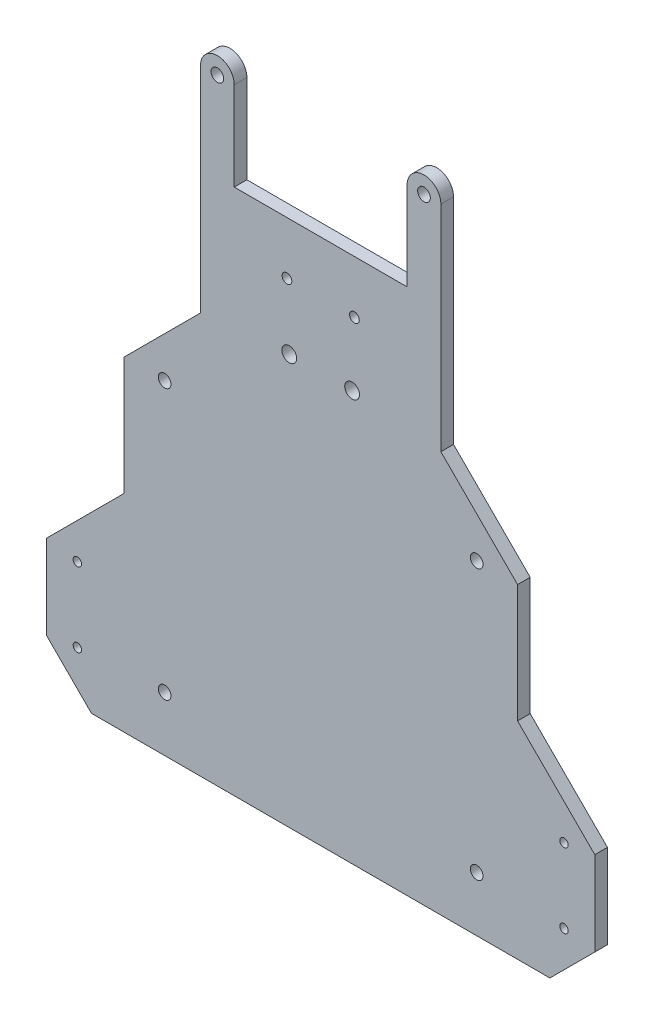
ISO-10303-21;
HEADER;
FILE_DESCRIPTION(('STEP AP214'),'2;1');
FILE_NAME('part.step','',(''),(''),'','','');
FILE_SCHEMA(('AUTOMOTIVE_DESIGN { 1 0 10303 214 1 1 1 1 }'));
ENDSEC;
DATA;
#1=APPLICATION_CONTEXT('core data for automotive mechanical design processes');
#2=APPLICATION_PROTOCOL_DEFINITION('international standard','automotive_design',2000,#1);
#3=PRODUCT_CONTEXT('',#1,'mechanical');
#4=PRODUCT('Part','Part','',(#3));
#5=PRODUCT_RELATED_PRODUCT_CATEGORY('part','',(#4));
#6=PRODUCT_DEFINITION_FORMATION('','',#4);
#7=PRODUCT_DEFINITION_CONTEXT('part definition',#1,'design');
#8=PRODUCT_DEFINITION('design','',#6,#7);
#9=PRODUCT_DEFINITION_SHAPE('','',#8);
#10=(LENGTH_UNIT() NAMED_UNIT(*) SI_UNIT(.MILLI.,.METRE.));
#11=(NAMED_UNIT(*) PLANE_ANGLE_UNIT() SI_UNIT($,.RADIAN.));
#12=(NAMED_UNIT(*) SI_UNIT($,.STERADIAN.) SOLID_ANGLE_UNIT());
#13=UNCERTAINTY_MEASURE_WITH_UNIT(LENGTH_MEASURE(1.E-05),#10,'distance_accuracy_value','');
#14=(GEOMETRIC_REPRESENTATION_CONTEXT(3) GLOBAL_UNCERTAINTY_ASSIGNED_CONTEXT((#13)) GLOBAL_UNIT_ASSIGNED_CONTEXT((#10,
#11,#12)) REPRESENTATION_CONTEXT('',''));
#15=CARTESIAN_POINT('',(0.,0.,0.));
#16=DIRECTION('',(0.,0.,1.));
#17=DIRECTION('',(1.,0.,0.));
#18=AXIS2_PLACEMENT_3D('',#15,#16,#17);
#19=CARTESIAN_POINT('',(-24.5,146.,3.));
#20=DIRECTION('',(0.,0.,1.));
#21=DIRECTION('',(1.,0.,0.));
#22=AXIS2_PLACEMENT_3D('',#19,#20,#21);
#23=PLANE('',#22);
#24=CARTESIAN_POINT('',(-8.,112.5,3.));
#25=DIRECTION('',(0.,0.,1.));
#26=DIRECTION('',(1.,0.,0.));
#27=AXIS2_PLACEMENT_3D('',#24,#25,#26);
#28=CIRCLE('',#27,1.14999999999999);
#29=CARTESIAN_POINT('',(-6.85,112.5,3.));
#30=VERTEX_POINT('',#29);
#31=EDGE_CURVE('E414',#30,#30,#28,.T.);
#32=ORIENTED_EDGE('',*,*,#31,.F.);
#33=EDGE_LOOP('',(#32));
#34=FACE_BOUND('',#33,.T.);
#35=CARTESIAN_POINT('',(-37.0000000000005,13.0000000000001,3.));
#36=DIRECTION('',(0.,0.,1.));
#37=DIRECTION('',(1.,0.,0.));
#38=AXIS2_PLACEMENT_3D('',#35,#36,#37);
#39=CIRCLE('',#38,1.50000000000044);
#40=CARTESIAN_POINT('',(-35.5000000000001,13.0000000000001,3.));
#41=VERTEX_POINT('',#40);
#42=EDGE_CURVE('E426',#41,#41,#39,.T.);
#43=ORIENTED_EDGE('',*,*,#42,.F.);
#44=EDGE_LOOP('',(#43));
#45=FACE_BOUND('',#44,.T.);
#46=CARTESIAN_POINT('',(57.7,29.4525922948518,3.));
#47=DIRECTION('',(0.,0.,1.));
#48=DIRECTION('',(1.,0.,0.));
#49=AXIS2_PLACEMENT_3D('',#46,#47,#48);
#50=CIRCLE('',#49,0.999999999999998);
#51=CARTESIAN_POINT('',(58.7,29.4525922948518,3.));
#52=VERTEX_POINT('',#51);
#53=EDGE_CURVE('E438',#52,#52,#50,.T.);
#54=ORIENTED_EDGE('',*,*,#53,.F.);
#55=EDGE_LOOP('',(#54));
#56=FACE_BOUND('',#55,.T.);
#57=CARTESIAN_POINT('',(-57.7000000000001,11.8525922948518,3.));
#58=DIRECTION('',(0.,0.,1.));
#59=DIRECTION('',(1.,0.,0.));
#60=AXIS2_PLACEMENT_3D('',#57,#58,#59);
#61=CIRCLE('',#60,0.999999999999991);
#62=CARTESIAN_POINT('',(-56.7000000000001,11.8525922948518,3.));
#63=VERTEX_POINT('',#62);
#64=EDGE_CURVE('E450',#63,#63,#61,.T.);
#65=ORIENTED_EDGE('',*,*,#64,.F.);
#66=EDGE_LOOP('',(#65));
#67=FACE_BOUND('',#66,.T.);
#68=CARTESIAN_POINT('',(37.,77.,3.));
#69=DIRECTION('',(0.,0.,1.));
#70=DIRECTION('',(1.,0.,0.));
#71=AXIS2_PLACEMENT_3D('',#68,#69,#70);
#72=CIRCLE('',#71,1.5);
#73=CARTESIAN_POINT('',(38.5,77.,3.));
#74=VERTEX_POINT('',#73);
#75=EDGE_CURVE('E462',#74,#74,#72,.T.);
#76=ORIENTED_EDGE('',*,*,#75,.F.);
#77=EDGE_LOOP('',(#76));
#78=FACE_BOUND('',#77,.T.);
#79=CARTESIAN_POINT('',(-24.5,146.,3.));
#80=DIRECTION('',(0.,0.,1.));
#81=DIRECTION('',(1.,0.,0.));
#82=AXIS2_PLACEMENT_3D('',#79,#80,#81);
#83=CIRCLE('',#82,1.5);
#84=CARTESIAN_POINT('',(-23.,146.,3.));
#85=VERTEX_POINT('',#84);
#86=EDGE_CURVE('E474',#85,#85,#83,.T.);
#87=ORIENTED_EDGE('',*,*,#86,.F.);
#88=EDGE_LOOP('',(#87));
#89=FACE_BOUND('',#88,.T.);
#90=CARTESIAN_POINT('',(7.44999999999998,97.1948700589276,3.));
#91=DIRECTION('',(0.,0.,1.));
#92=DIRECTION('',(1.,0.,0.));
#93=AXIS2_PLACEMENT_3D('',#90,#91,#92);
#94=CIRCLE('',#93,1.75);
#95=CARTESIAN_POINT('',(9.19999999999999,97.1948700589276,3.));
#96=VERTEX_POINT('',#95);
#97=EDGE_CURVE('E199',#96,#96,#94,.T.);
#98=ORIENTED_EDGE('',*,*,#97,.F.);
#99=EDGE_LOOP('',(#98));
#100=FACE_BOUND('',#99,.T.);
#101=CARTESIAN_POINT('',(-24.5,146.,3.));
#102=DIRECTION('',(0.,0.,1.));
#103=DIRECTION('',(1.,0.,0.));
#104=AXIS2_PLACEMENT_3D('',#101,#102,#103);
#105=CIRCLE('',#104,3.99999999999997);
#106=CARTESIAN_POINT('',(-20.5,146.,3.));
#107=VERTEX_POINT('',#106);
#108=CARTESIAN_POINT('',(-28.4999999999999,146.,3.));
#109=VERTEX_POINT('',#108);
#110=EDGE_CURVE('E230',#107,#109,#105,.T.);
#111=ORIENTED_EDGE('',*,*,#110,.T.);
#112=DIRECTION('',(0.,-1.,0.));
#113=VECTOR('',#112,1.);
#114=CARTESIAN_POINT('',(-28.4999999999999,146.,3.));
#115=LINE('',#114,#113);
#116=CARTESIAN_POINT('',(-28.5000000000001,95.1525922948518,3.));
#117=VERTEX_POINT('',#116);
#118=EDGE_CURVE('E128',#109,#117,#115,.T.);
#119=ORIENTED_EDGE('',*,*,#118,.T.);
#120=DIRECTION('',(-0.707106781186546,-0.707106781186549,0.));
#121=VECTOR('',#120,1.);
#122=CARTESIAN_POINT('',(-28.5000000000001,95.1525922948518,3.));
#123=LINE('',#122,#121);
#124=CARTESIAN_POINT('',(-46.689180080496,76.9634122143558,3.));
#125=VERTEX_POINT('',#124);
#126=EDGE_CURVE('E275',#117,#125,#123,.T.);
#127=ORIENTED_EDGE('',*,*,#126,.T.);
#128=DIRECTION('',(0.,-1.,0.));
#129=VECTOR('',#128,1.);
#130=CARTESIAN_POINT('',(-46.689180080496,76.9634122143558,3.));
#131=LINE('',#130,#129);
#132=CARTESIAN_POINT('',(-46.689180080496,48.9634122143558,3.));
#133=VERTEX_POINT('',#132);
#134=EDGE_CURVE('E294',#125,#133,#131,.T.);
#135=ORIENTED_EDGE('',*,*,#134,.T.);
#136=DIRECTION('',(-0.707106781186547,-0.707106781186548,0.));
#137=VECTOR('',#136,1.);
#138=CARTESIAN_POINT('',(-46.689180080496,48.9634122143558,3.));
#139=LINE('',#138,#137);
#140=CARTESIAN_POINT('',(-65.,30.6525922948518,3.));
#141=VERTEX_POINT('',#140);
#142=EDGE_CURVE('E291',#133,#141,#139,.T.);
#143=ORIENTED_EDGE('',*,*,#142,.T.);
#144=DIRECTION('',(0.,-1.,0.));
#145=VECTOR('',#144,1.);
#146=CARTESIAN_POINT('',(-65.,30.6525922948518,3.));
#147=LINE('',#146,#145);
#148=CARTESIAN_POINT('',(-65.,10.6525922948518,3.));
#149=VERTEX_POINT('',#148);
#150=EDGE_CURVE('E293',#141,#149,#147,.T.);
#151=ORIENTED_EDGE('',*,*,#150,.T.);
#152=DIRECTION('',(0.707106781186544,-0.707106781186551,0.));
#153=VECTOR('',#152,1.);
#154=CARTESIAN_POINT('',(-65.,10.6525922948518,3.));
#155=LINE('',#154,#153);
#156=CARTESIAN_POINT('',(-54.3474077051483,0.,3.));
#157=VERTEX_POINT('',#156);
#158=EDGE_CURVE('E296',#149,#157,#155,.T.);
#159=ORIENTED_EDGE('',*,*,#158,.T.);
#160=DIRECTION('',(1.,0.,0.));
#161=VECTOR('',#160,1.);
#162=CARTESIAN_POINT('',(-54.3474077051483,0.,3.));
#163=LINE('',#162,#161);
#164=CARTESIAN_POINT('',(54.3474077051483,5.66428228146502E-13,3.));
#165=VERTEX_POINT('',#164);
#166=EDGE_CURVE('E302',#157,#165,#163,.T.);
#167=ORIENTED_EDGE('',*,*,#166,.T.);
#168=DIRECTION('',(0.707106781186544,0.707106781186551,0.));
#169=VECTOR('',#168,1.);
#170=CARTESIAN_POINT('',(54.3474077051483,5.66428228146502E-13,3.));
#171=LINE('',#170,#169);
#172=CARTESIAN_POINT('',(64.9999999999999,10.6525922948523,3.));
#173=VERTEX_POINT('',#172);
#174=EDGE_CURVE('E304',#165,#173,#171,.T.);
#175=ORIENTED_EDGE('',*,*,#174,.T.);
#176=DIRECTION('',(0.,1.,0.));
#177=VECTOR('',#176,1.);
#178=CARTESIAN_POINT('',(64.9999999999999,10.6525922948523,3.));
#179=LINE('',#178,#177);
#180=CARTESIAN_POINT('',(64.9999999999998,30.6525922948524,3.));
#181=VERTEX_POINT('',#180);
#182=EDGE_CURVE('E306',#173,#181,#179,.T.);
#183=ORIENTED_EDGE('',*,*,#182,.T.);
#184=DIRECTION('',(-0.707106781186551,0.707106781186544,0.));
#185=VECTOR('',#184,1.);
#186=CARTESIAN_POINT('',(64.9999999999998,30.6525922948524,3.));
#187=LINE('',#186,#185);
#188=CARTESIAN_POINT('',(46.6891800804957,48.9634122143563,3.));
#189=VERTEX_POINT('',#188);
#190=EDGE_CURVE('E308',#181,#189,#187,.T.);
#191=ORIENTED_EDGE('',*,*,#190,.T.);
#192=DIRECTION('',(0.,1.,0.));
#193=VECTOR('',#192,1.);
#194=CARTESIAN_POINT('',(46.6891800804957,48.9634122143563,3.));
#195=LINE('',#194,#193);
#196=CARTESIAN_POINT('',(46.6891800804956,76.9634122143567,3.));
#197=VERTEX_POINT('',#196);
#198=EDGE_CURVE('E310',#189,#197,#195,.T.);
#199=ORIENTED_EDGE('',*,*,#198,.T.);
#200=DIRECTION('',(-0.707106781186551,0.707106781186544,0.));
#201=VECTOR('',#200,1.);
#202=CARTESIAN_POINT('',(46.6891800804956,76.9634122143567,3.));
#203=LINE('',#202,#201);
#204=CARTESIAN_POINT('',(28.4999999999996,95.1525922948524,3.));
#205=VERTEX_POINT('',#204);
#206=EDGE_CURVE('E312',#197,#205,#203,.T.);
#207=ORIENTED_EDGE('',*,*,#206,.T.);
#208=DIRECTION('',(0.,1.,0.));
#209=VECTOR('',#208,1.);
#210=CARTESIAN_POINT('',(28.4999999999996,95.1525922948524,3.));
#211=LINE('',#210,#209);
#212=CARTESIAN_POINT('',(28.4999999999994,146.000000000001,3.));
#213=VERTEX_POINT('',#212);
#214=EDGE_CURVE('E314',#205,#213,#211,.T.);
#215=ORIENTED_EDGE('',*,*,#214,.T.);
#216=CARTESIAN_POINT('',(24.5000000000001,146.,3.));
#217=DIRECTION('',(0.,0.,1.));
#218=DIRECTION('',(1.,0.,0.));
#219=AXIS2_PLACEMENT_3D('',#216,#217,#218);
#220=CIRCLE('',#219,3.99999999999934);
#221=CARTESIAN_POINT('',(20.5000000000007,146.,3.));
#222=VERTEX_POINT('',#221);
#223=EDGE_CURVE('E177',#213,#222,#220,.T.);
#224=ORIENTED_EDGE('',*,*,#223,.T.);
#225=DIRECTION('',(0.,-1.,0.));
#226=VECTOR('',#225,1.);
#227=CARTESIAN_POINT('',(20.5000000000007,146.,3.));
#228=LINE('',#227,#226);
#229=CARTESIAN_POINT('',(20.5000000000002,125.,3.));
#230=VERTEX_POINT('',#229);
#231=EDGE_CURVE('E171',#222,#230,#228,.T.);
#232=ORIENTED_EDGE('',*,*,#231,.T.);
#233=DIRECTION('',(-1.,0.,0.));
#234=VECTOR('',#233,1.);
#235=CARTESIAN_POINT('',(20.5000000000002,125.,3.));
#236=LINE('',#235,#234);
#237=CARTESIAN_POINT('',(-20.5000000000001,125.,3.));
#238=VERTEX_POINT('',#237);
#239=EDGE_CURVE('E175',#230,#238,#236,.T.);
#240=ORIENTED_EDGE('',*,*,#239,.T.);
#241=DIRECTION('',(0.,1.,0.));
#242=VECTOR('',#241,1.);
#243=CARTESIAN_POINT('',(-20.5000000000001,125.,3.));
#244=LINE('',#243,#242);
#245=EDGE_CURVE('E55',#238,#107,#244,.T.);
#246=ORIENTED_EDGE('',*,*,#245,.T.);
#247=EDGE_LOOP('',(#111,#119,#127,#135,#143,#151,#159,#167,#175,#183,#191,#199,#207,#215,#224,
#232,#240,#246));
#248=FACE_BOUND('',#247,.T.);
#249=CARTESIAN_POINT('',(8.,112.5,3.));
#250=DIRECTION('',(0.,0.,1.));
#251=DIRECTION('',(-1.,0.,0.));
#252=AXIS2_PLACEMENT_3D('',#249,#250,#251);
#253=CIRCLE('',#252,1.14999999999999);
#254=CARTESIAN_POINT('',(6.85,112.5,3.));
#255=VERTEX_POINT('',#254);
#256=EDGE_CURVE('E480',#255,#255,#253,.T.);
#257=ORIENTED_EDGE('',*,*,#256,.F.);
#258=EDGE_LOOP('',(#257));
#259=FACE_BOUND('',#258,.T.);
#260=CARTESIAN_POINT('',(36.9999999999996,13.0000000000023,3.));
#261=DIRECTION('',(0.,0.,1.));
#262=DIRECTION('',(1.,0.,0.));
#263=AXIS2_PLACEMENT_3D('',#260,#261,#262);
#264=CIRCLE('',#263,1.49999999999972);
#265=CARTESIAN_POINT('',(38.4999999999993,13.0000000000023,3.));
#266=VERTEX_POINT('',#265);
#267=EDGE_CURVE('E468',#266,#266,#264,.T.);
#268=ORIENTED_EDGE('',*,*,#267,.F.);
#269=EDGE_LOOP('',(#268));
#270=FACE_BOUND('',#269,.T.);
#271=CARTESIAN_POINT('',(57.7,11.8525922948518,3.));
#272=DIRECTION('',(0.,0.,1.));
#273=DIRECTION('',(1.,0.,0.));
#274=AXIS2_PLACEMENT_3D('',#271,#272,#273);
#275=CIRCLE('',#274,0.999999999999991);
#276=CARTESIAN_POINT('',(58.7,11.8525922948518,3.));
#277=VERTEX_POINT('',#276);
#278=EDGE_CURVE('E456',#277,#277,#275,.T.);
#279=ORIENTED_EDGE('',*,*,#278,.F.);
#280=EDGE_LOOP('',(#279));
#281=FACE_BOUND('',#280,.T.);
#282=CARTESIAN_POINT('',(-57.7000000000001,29.4525922948518,3.));
#283=DIRECTION('',(0.,0.,1.));
#284=DIRECTION('',(1.,0.,0.));
#285=AXIS2_PLACEMENT_3D('',#282,#283,#284);
#286=CIRCLE('',#285,0.999999999999998);
#287=CARTESIAN_POINT('',(-56.7000000000001,29.4525922948518,3.));
#288=VERTEX_POINT('',#287);
#289=EDGE_CURVE('E444',#288,#288,#286,.T.);
#290=ORIENTED_EDGE('',*,*,#289,.F.);
#291=EDGE_LOOP('',(#290));
#292=FACE_BOUND('',#291,.T.);
#293=CARTESIAN_POINT('',(-37.0000000000075,77.0000000000001,3.));
#294=DIRECTION('',(0.,0.,1.));
#295=DIRECTION('',(1.,0.,0.));
#296=AXIS2_PLACEMENT_3D('',#293,#294,#295);
#297=CIRCLE('',#296,1.50000000000712);
#298=CARTESIAN_POINT('',(-35.5000000000004,77.0000000000001,3.));
#299=VERTEX_POINT('',#298);
#300=EDGE_CURVE('E432',#299,#299,#297,.T.);
#301=ORIENTED_EDGE('',*,*,#300,.F.);
#302=EDGE_LOOP('',(#301));
#303=FACE_BOUND('',#302,.T.);
#304=CARTESIAN_POINT('',(24.5000000000001,146.,3.));
#305=DIRECTION('',(0.,0.,1.));
#306=DIRECTION('',(1.,0.,0.));
#307=AXIS2_PLACEMENT_3D('',#304,#305,#306);
#308=CIRCLE('',#307,1.49999999999982);
#309=CARTESIAN_POINT('',(25.9999999999999,146.,3.));
#310=VERTEX_POINT('',#309);
#311=EDGE_CURVE('E420',#310,#310,#308,.T.);
#312=ORIENTED_EDGE('',*,*,#311,.F.);
#313=EDGE_LOOP('',(#312));
#314=FACE_BOUND('',#313,.T.);
#315=CARTESIAN_POINT('',(-7.45000000000001,97.1948700589276,3.));
#316=DIRECTION('',(0.,0.,1.));
#317=DIRECTION('',(1.,0.,0.));
#318=AXIS2_PLACEMENT_3D('',#315,#316,#317);
#319=CIRCLE('',#318,1.75);
#320=CARTESIAN_POINT('',(-5.7,97.1948700589276,3.));
#321=VERTEX_POINT('',#320);
#322=EDGE_CURVE('E405',#321,#321,#319,.T.);
#323=ORIENTED_EDGE('',*,*,#322,.F.);
#324=EDGE_LOOP('',(#323));
#325=FACE_BOUND('',#324,.T.);
#326=ADVANCED_FACE('F38',(#34,#45,#56,#67,#78,#89,#100,#248,#259,#270,#281,#292,#303,#314,#325),
#23,.T.);
#327=CARTESIAN_POINT('',(-24.5,146.,0.));
#328=DIRECTION('',(0.,0.,1.));
#329=DIRECTION('',(1.,0.,0.));
#330=AXIS2_PLACEMENT_3D('',#327,#328,#329);
#331=PLANE('',#330);
#332=CARTESIAN_POINT('',(-24.5,146.,0.));
#333=DIRECTION('',(0.,0.,1.));
#334=DIRECTION('',(1.,0.,0.));
#335=AXIS2_PLACEMENT_3D('',#332,#333,#334);
#336=CIRCLE('',#335,3.99999999999997);
#337=CARTESIAN_POINT('',(-20.5,146.,0.));
#338=VERTEX_POINT('',#337);
#339=CARTESIAN_POINT('',(-28.4999999999999,146.,0.));
#340=VERTEX_POINT('',#339);
#341=EDGE_CURVE('E195',#338,#340,#336,.T.);
#342=ORIENTED_EDGE('',*,*,#341,.F.);
#343=DIRECTION('',(0.,1.,0.));
#344=VECTOR('',#343,1.);
#345=CARTESIAN_POINT('',(-20.5000000000001,125.,0.));
#346=LINE('',#345,#344);
#347=CARTESIAN_POINT('',(-20.5000000000001,125.,0.));
#348=VERTEX_POINT('',#347);
#349=EDGE_CURVE('E120',#348,#338,#346,.T.);
#350=ORIENTED_EDGE('',*,*,#349,.F.);
#351=DIRECTION('',(-1.,0.,0.));
#352=VECTOR('',#351,1.);
#353=CARTESIAN_POINT('',(20.5000000000002,125.,0.));
#354=LINE('',#353,#352);
#355=CARTESIAN_POINT('',(20.5000000000002,125.,0.));
#356=VERTEX_POINT('',#355);
#357=EDGE_CURVE('E114',#356,#348,#354,.T.);
#358=ORIENTED_EDGE('',*,*,#357,.F.);
#359=DIRECTION('',(0.,-1.,0.));
#360=VECTOR('',#359,1.);
#361=CARTESIAN_POINT('',(20.5000000000007,146.,0.));
#362=LINE('',#361,#360);
#363=CARTESIAN_POINT('',(20.5000000000007,146.,0.));
#364=VERTEX_POINT('',#363);
#365=EDGE_CURVE('E185',#364,#356,#362,.T.);
#366=ORIENTED_EDGE('',*,*,#365,.F.);
#367=CARTESIAN_POINT('',(24.5000000000001,146.,0.));
#368=DIRECTION('',(0.,0.,1.));
#369=DIRECTION('',(1.,0.,0.));
#370=AXIS2_PLACEMENT_3D('',#367,#368,#369);
#371=CIRCLE('',#370,3.99999999999934);
#372=CARTESIAN_POINT('',(28.4999999999994,146.000000000001,0.));
#373=VERTEX_POINT('',#372);
#374=EDGE_CURVE('E225',#373,#364,#371,.T.);
#375=ORIENTED_EDGE('',*,*,#374,.F.);
#376=DIRECTION('',(0.,1.,0.));
#377=VECTOR('',#376,1.);
#378=CARTESIAN_POINT('',(28.4999999999996,95.1525922948524,0.));
#379=LINE('',#378,#377);
#380=CARTESIAN_POINT('',(28.4999999999996,95.1525922948524,0.));
#381=VERTEX_POINT('',#380);
#382=EDGE_CURVE('E223',#381,#373,#379,.T.);
#383=ORIENTED_EDGE('',*,*,#382,.F.);
#384=DIRECTION('',(-0.707106781186551,0.707106781186544,0.));
#385=VECTOR('',#384,1.);
#386=CARTESIAN_POINT('',(46.6891800804956,76.9634122143567,0.));
#387=LINE('',#386,#385);
#388=CARTESIAN_POINT('',(46.6891800804956,76.9634122143567,0.));
#389=VERTEX_POINT('',#388);
#390=EDGE_CURVE('E221',#389,#381,#387,.T.);
#391=ORIENTED_EDGE('',*,*,#390,.F.);
#392=DIRECTION('',(0.,1.,0.));
#393=VECTOR('',#392,1.);
#394=CARTESIAN_POINT('',(46.6891800804957,48.9634122143563,0.));
#395=LINE('',#394,#393);
#396=CARTESIAN_POINT('',(46.6891800804957,48.9634122143563,0.));
#397=VERTEX_POINT('',#396);
#398=EDGE_CURVE('E219',#397,#389,#395,.T.);
#399=ORIENTED_EDGE('',*,*,#398,.F.);
#400=DIRECTION('',(-0.707106781186551,0.707106781186544,0.));
#401=VECTOR('',#400,1.);
#402=CARTESIAN_POINT('',(64.9999999999998,30.6525922948524,0.));
#403=LINE('',#402,#401);
#404=CARTESIAN_POINT('',(64.9999999999998,30.6525922948524,0.));
#405=VERTEX_POINT('',#404);
#406=EDGE_CURVE('E217',#405,#397,#403,.T.);
#407=ORIENTED_EDGE('',*,*,#406,.F.);
#408=DIRECTION('',(0.,1.,0.));
#409=VECTOR('',#408,1.);
#410=CARTESIAN_POINT('',(64.9999999999999,10.6525922948523,0.));
#411=LINE('',#410,#409);
#412=CARTESIAN_POINT('',(64.9999999999999,10.6525922948523,0.));
#413=VERTEX_POINT('',#412);
#414=EDGE_CURVE('E215',#413,#405,#411,.T.);
#415=ORIENTED_EDGE('',*,*,#414,.F.);
#416=DIRECTION('',(0.707106781186544,0.707106781186551,0.));
#417=VECTOR('',#416,1.);
#418=CARTESIAN_POINT('',(54.3474077051483,5.66428228146502E-13,0.));
#419=LINE('',#418,#417);
#420=CARTESIAN_POINT('',(54.3474077051483,5.66428228146502E-13,0.));
#421=VERTEX_POINT('',#420);
#422=EDGE_CURVE('E213',#421,#413,#419,.T.);
#423=ORIENTED_EDGE('',*,*,#422,.F.);
#424=DIRECTION('',(1.,0.,0.));
#425=VECTOR('',#424,1.);
#426=CARTESIAN_POINT('',(-54.3474077051483,0.,0.));
#427=LINE('',#426,#425);
#428=CARTESIAN_POINT('',(-54.3474077051483,0.,0.));
#429=VERTEX_POINT('',#428);
#430=EDGE_CURVE('E211',#429,#421,#427,.T.);
#431=ORIENTED_EDGE('',*,*,#430,.F.);
#432=DIRECTION('',(0.707106781186544,-0.707106781186551,0.));
#433=VECTOR('',#432,1.);
#434=CARTESIAN_POINT('',(-65.,10.6525922948518,0.));
#435=LINE('',#434,#433);
#436=CARTESIAN_POINT('',(-65.,10.6525922948518,0.));
#437=VERTEX_POINT('',#436);
#438=EDGE_CURVE('E209',#437,#429,#435,.T.);
#439=ORIENTED_EDGE('',*,*,#438,.F.);
#440=DIRECTION('',(0.,-1.,0.));
#441=VECTOR('',#440,1.);
#442=CARTESIAN_POINT('',(-65.,30.6525922948518,0.));
#443=LINE('',#442,#441);
#444=CARTESIAN_POINT('',(-65.,30.6525922948518,0.));
#445=VERTEX_POINT('',#444);
#446=EDGE_CURVE('E207',#445,#437,#443,.T.);
#447=ORIENTED_EDGE('',*,*,#446,.F.);
#448=DIRECTION('',(-0.707106781186547,-0.707106781186548,0.));
#449=VECTOR('',#448,1.);
#450=CARTESIAN_POINT('',(-46.689180080496,48.9634122143558,0.));
#451=LINE('',#450,#449);
#452=CARTESIAN_POINT('',(-46.689180080496,48.9634122143558,0.));
#453=VERTEX_POINT('',#452);
#454=EDGE_CURVE('E205',#453,#445,#451,.T.);
#455=ORIENTED_EDGE('',*,*,#454,.F.);
#456=DIRECTION('',(0.,-1.,0.));
#457=VECTOR('',#456,1.);
#458=CARTESIAN_POINT('',(-46.689180080496,76.9634122143558,0.));
#459=LINE('',#458,#457);
#460=CARTESIAN_POINT('',(-46.689180080496,76.9634122143558,0.));
#461=VERTEX_POINT('',#460);
#462=EDGE_CURVE('E203',#461,#453,#459,.T.);
#463=ORIENTED_EDGE('',*,*,#462,.F.);
#464=DIRECTION('',(-0.707106781186546,-0.707106781186549,0.));
#465=VECTOR('',#464,1.);
#466=CARTESIAN_POINT('',(-28.5000000000001,95.1525922948518,0.));
#467=LINE('',#466,#465);
#468=CARTESIAN_POINT('',(-28.5000000000001,95.1525922948518,0.));
#469=VERTEX_POINT('',#468);
#470=EDGE_CURVE('E201',#469,#461,#467,.T.);
#471=ORIENTED_EDGE('',*,*,#470,.F.);
#472=DIRECTION('',(0.,-1.,0.));
#473=VECTOR('',#472,1.);
#474=CARTESIAN_POINT('',(-28.4999999999999,146.,0.));
#475=LINE('',#474,#473);
#476=EDGE_CURVE('E198',#340,#469,#475,.T.);
#477=ORIENTED_EDGE('',*,*,#476,.F.);
#478=EDGE_LOOP('',(#342,#350,#358,#366,#375,#383,#391,#399,#407,#415,#423,#431,#439,#447,#455,
#463,#471,#477));
#479=FACE_BOUND('',#478,.T.);
#480=CARTESIAN_POINT('',(7.44999999999998,97.1948700589276,0.));
#481=DIRECTION('',(0.,0.,1.));
#482=DIRECTION('',(1.,0.,0.));
#483=AXIS2_PLACEMENT_3D('',#480,#481,#482);
#484=CIRCLE('',#483,1.75);
#485=CARTESIAN_POINT('',(9.19999999999999,97.1948700589276,0.));
#486=VERTEX_POINT('',#485);
#487=EDGE_CURVE('E483',#486,#486,#484,.T.);
#488=ORIENTED_EDGE('',*,*,#487,.T.);
#489=EDGE_LOOP('',(#488));
#490=FACE_BOUND('',#489,.T.);
#491=CARTESIAN_POINT('',(8.,112.5,0.));
#492=DIRECTION('',(0.,0.,1.));
#493=DIRECTION('',(-1.,0.,0.));
#494=AXIS2_PLACEMENT_3D('',#491,#492,#493);
#495=CIRCLE('',#494,1.14999999999999);
#496=CARTESIAN_POINT('',(6.85,112.5,0.));
#497=VERTEX_POINT('',#496);
#498=EDGE_CURVE('E477',#497,#497,#495,.T.);
#499=ORIENTED_EDGE('',*,*,#498,.T.);
#500=EDGE_LOOP('',(#499));
#501=FACE_BOUND('',#500,.T.);
#502=CARTESIAN_POINT('',(-24.5,146.,0.));
#503=DIRECTION('',(0.,0.,1.));
#504=DIRECTION('',(1.,0.,0.));
#505=AXIS2_PLACEMENT_3D('',#502,#503,#504);
#506=CIRCLE('',#505,1.5);
#507=CARTESIAN_POINT('',(-23.,146.,0.));
#508=VERTEX_POINT('',#507);
#509=EDGE_CURVE('E471',#508,#508,#506,.T.);
#510=ORIENTED_EDGE('',*,*,#509,.T.);
#511=EDGE_LOOP('',(#510));
#512=FACE_BOUND('',#511,.T.);
#513=CARTESIAN_POINT('',(36.9999999999996,13.0000000000023,0.));
#514=DIRECTION('',(0.,0.,1.));
#515=DIRECTION('',(1.,0.,0.));
#516=AXIS2_PLACEMENT_3D('',#513,#514,#515);
#517=CIRCLE('',#516,1.49999999999972);
#518=CARTESIAN_POINT('',(38.4999999999993,13.0000000000023,0.));
#519=VERTEX_POINT('',#518);
#520=EDGE_CURVE('E465',#519,#519,#517,.T.);
#521=ORIENTED_EDGE('',*,*,#520,.T.);
#522=EDGE_LOOP('',(#521));
#523=FACE_BOUND('',#522,.T.);
#524=CARTESIAN_POINT('',(37.,77.,0.));
#525=DIRECTION('',(0.,0.,1.));
#526=DIRECTION('',(1.,0.,0.));
#527=AXIS2_PLACEMENT_3D('',#524,#525,#526);
#528=CIRCLE('',#527,1.5);
#529=CARTESIAN_POINT('',(38.5,77.,0.));
#530=VERTEX_POINT('',#529);
#531=EDGE_CURVE('E459',#530,#530,#528,.T.);
#532=ORIENTED_EDGE('',*,*,#531,.T.);
#533=EDGE_LOOP('',(#532));
#534=FACE_BOUND('',#533,.T.);
#535=CARTESIAN_POINT('',(57.7,11.8525922948518,0.));
#536=DIRECTION('',(0.,0.,1.));
#537=DIRECTION('',(1.,0.,0.));
#538=AXIS2_PLACEMENT_3D('',#535,#536,#537);
#539=CIRCLE('',#538,0.999999999999991);
#540=CARTESIAN_POINT('',(58.7,11.8525922948518,0.));
#541=VERTEX_POINT('',#540);
#542=EDGE_CURVE('E453',#541,#541,#539,.T.);
#543=ORIENTED_EDGE('',*,*,#542,.T.);
#544=EDGE_LOOP('',(#543));
#545=FACE_BOUND('',#544,.T.);
#546=CARTESIAN_POINT('',(-57.7000000000001,11.8525922948518,0.));
#547=DIRECTION('',(0.,0.,1.));
#548=DIRECTION('',(1.,0.,0.));
#549=AXIS2_PLACEMENT_3D('',#546,#547,#548);
#550=CIRCLE('',#549,0.999999999999991);
#551=CARTESIAN_POINT('',(-56.7000000000001,11.8525922948518,0.));
#552=VERTEX_POINT('',#551);
#553=EDGE_CURVE('E447',#552,#552,#550,.T.);
#554=ORIENTED_EDGE('',*,*,#553,.T.);
#555=EDGE_LOOP('',(#554));
#556=FACE_BOUND('',#555,.T.);
#557=CARTESIAN_POINT('',(-57.7000000000001,29.4525922948518,0.));
#558=DIRECTION('',(0.,0.,1.));
#559=DIRECTION('',(1.,0.,0.));
#560=AXIS2_PLACEMENT_3D('',#557,#558,#559);
#561=CIRCLE('',#560,0.999999999999998);
#562=CARTESIAN_POINT('',(-56.7000000000001,29.4525922948518,0.));
#563=VERTEX_POINT('',#562);
#564=EDGE_CURVE('E441',#563,#563,#561,.T.);
#565=ORIENTED_EDGE('',*,*,#564,.T.);
#566=EDGE_LOOP('',(#565));
#567=FACE_BOUND('',#566,.T.);
#568=CARTESIAN_POINT('',(57.7,29.4525922948518,0.));
#569=DIRECTION('',(0.,0.,1.));
#570=DIRECTION('',(1.,0.,0.));
#571=AXIS2_PLACEMENT_3D('',#568,#569,#570);
#572=CIRCLE('',#571,0.999999999999998);
#573=CARTESIAN_POINT('',(58.7,29.4525922948518,0.));
#574=VERTEX_POINT('',#573);
#575=EDGE_CURVE('E435',#574,#574,#572,.T.);
#576=ORIENTED_EDGE('',*,*,#575,.T.);
#577=EDGE_LOOP('',(#576));
#578=FACE_BOUND('',#577,.T.);
#579=CARTESIAN_POINT('',(-37.0000000000075,77.0000000000001,0.));
#580=DIRECTION('',(0.,0.,1.));
#581=DIRECTION('',(1.,0.,0.));
#582=AXIS2_PLACEMENT_3D('',#579,#580,#581);
#583=CIRCLE('',#582,1.50000000000712);
#584=CARTESIAN_POINT('',(-35.5000000000004,77.0000000000001,0.));
#585=VERTEX_POINT('',#584);
#586=EDGE_CURVE('E429',#585,#585,#583,.T.);
#587=ORIENTED_EDGE('',*,*,#586,.T.);
#588=EDGE_LOOP('',(#587));
#589=FACE_BOUND('',#588,.T.);
#590=CARTESIAN_POINT('',(-37.0000000000005,13.0000000000001,0.));
#591=DIRECTION('',(0.,0.,1.));
#592=DIRECTION('',(1.,0.,0.));
#593=AXIS2_PLACEMENT_3D('',#590,#591,#592);
#594=CIRCLE('',#593,1.50000000000044);
#595=CARTESIAN_POINT('',(-35.5000000000001,13.0000000000001,0.));
#596=VERTEX_POINT('',#595);
#597=EDGE_CURVE('E423',#596,#596,#594,.T.);
#598=ORIENTED_EDGE('',*,*,#597,.T.);
#599=EDGE_LOOP('',(#598));
#600=FACE_BOUND('',#599,.T.);
#601=CARTESIAN_POINT('',(24.5000000000001,146.,0.));
#602=DIRECTION('',(0.,0.,1.));
#603=DIRECTION('',(1.,0.,0.));
#604=AXIS2_PLACEMENT_3D('',#601,#602,#603);
#605=CIRCLE('',#604,1.49999999999982);
#606=CARTESIAN_POINT('',(25.9999999999999,146.,0.));
#607=VERTEX_POINT('',#606);
#608=EDGE_CURVE('E417',#607,#607,#605,.T.);
#609=ORIENTED_EDGE('',*,*,#608,.T.);
#610=EDGE_LOOP('',(#609));
#611=FACE_BOUND('',#610,.T.);
#612=CARTESIAN_POINT('',(-8.,112.5,0.));
#613=DIRECTION('',(0.,0.,1.));
#614=DIRECTION('',(1.,0.,0.));
#615=AXIS2_PLACEMENT_3D('',#612,#613,#614);
#616=CIRCLE('',#615,1.14999999999999);
#617=CARTESIAN_POINT('',(-6.85,112.5,0.));
#618=VERTEX_POINT('',#617);
#619=EDGE_CURVE('E411',#618,#618,#616,.T.);
#620=ORIENTED_EDGE('',*,*,#619,.T.);
#621=EDGE_LOOP('',(#620));
#622=FACE_BOUND('',#621,.T.);
#623=CARTESIAN_POINT('',(-7.45000000000001,97.1948700589276,0.));
#624=DIRECTION('',(0.,0.,1.));
#625=DIRECTION('',(1.,0.,0.));
#626=AXIS2_PLACEMENT_3D('',#623,#624,#625);
#627=CIRCLE('',#626,1.75);
#628=CARTESIAN_POINT('',(-5.7,97.1948700589276,0.));
#629=VERTEX_POINT('',#628);
#630=EDGE_CURVE('E408',#629,#629,#627,.T.);
#631=ORIENTED_EDGE('',*,*,#630,.T.);
#632=EDGE_LOOP('',(#631));
#633=FACE_BOUND('',#632,.T.);
#634=ADVANCED_FACE('F279',(#479,#490,#501,#512,#523,#534,#545,#556,#567,#578,#589,#600,#611,
#622,#633),#331,.F.);
#635=CARTESIAN_POINT('',(-24.5,146.,3.));
#636=DIRECTION('',(0.,0.,-1.));
#637=DIRECTION('',(-1.,0.,0.));
#638=AXIS2_PLACEMENT_3D('',#635,#636,#637);
#639=CYLINDRICAL_SURFACE('',#638,3.99999999999997);
#640=ORIENTED_EDGE('',*,*,#341,.T.);
#641=DIRECTION('',(0.,0.,-1.));
#642=VECTOR('',#641,1.);
#643=CARTESIAN_POINT('',(-28.4999999999999,146.,3.));
#644=LINE('',#643,#642);
#645=EDGE_CURVE('E11',#109,#340,#644,.T.);
#646=ORIENTED_EDGE('',*,*,#645,.F.);
#647=ORIENTED_EDGE('',*,*,#110,.F.);
#648=DIRECTION('',(0.,0.,-1.));
#649=VECTOR('',#648,1.);
#650=CARTESIAN_POINT('',(-20.5,146.,3.));
#651=LINE('',#650,#649);
#652=EDGE_CURVE('E191',#107,#338,#651,.T.);
#653=ORIENTED_EDGE('',*,*,#652,.T.);
#654=EDGE_LOOP('',(#640,#646,#647,#653));
#655=FACE_BOUND('',#654,.T.);
#656=ADVANCED_FACE('F40',(#655),#639,.T.);
#657=CARTESIAN_POINT('',(-28.4999999999999,146.,3.));
#658=DIRECTION('',(1.,0.,0.));
#659=DIRECTION('',(0.,1.,0.));
#660=AXIS2_PLACEMENT_3D('',#657,#658,#659);
#661=PLANE('',#660);
#662=ORIENTED_EDGE('',*,*,#476,.T.);
#663=DIRECTION('',(0.,0.,-1.));
#664=VECTOR('',#663,1.);
#665=CARTESIAN_POINT('',(-28.5000000000001,95.1525922948518,3.));
#666=LINE('',#665,#664);
#667=EDGE_CURVE('E47',#117,#469,#666,.T.);
#668=ORIENTED_EDGE('',*,*,#667,.F.);
#669=ORIENTED_EDGE('',*,*,#118,.F.);
#670=ORIENTED_EDGE('',*,*,#645,.T.);
#671=EDGE_LOOP('',(#662,#668,#669,#670));
#672=FACE_BOUND('',#671,.T.);
#673=ADVANCED_FACE('F759',(#672),#661,.F.);
#674=CARTESIAN_POINT('',(-28.5000000000001,95.1525922948518,3.));
#675=DIRECTION('',(0.707106781186549,-0.707106781186546,0.));
#676=DIRECTION('',(0.707106781186546,0.707106781186549,0.));
#677=AXIS2_PLACEMENT_3D('',#674,#675,#676);
#678=PLANE('',#677);
#679=ORIENTED_EDGE('',*,*,#470,.T.);
#680=DIRECTION('',(0.,0.,-1.));
#681=VECTOR('',#680,1.);
#682=CARTESIAN_POINT('',(-46.689180080496,76.9634122143558,3.));
#683=LINE('',#682,#681);
#684=EDGE_CURVE('E267',#125,#461,#683,.T.);
#685=ORIENTED_EDGE('',*,*,#684,.F.);
#686=ORIENTED_EDGE('',*,*,#126,.F.);
#687=ORIENTED_EDGE('',*,*,#667,.T.);
#688=EDGE_LOOP('',(#679,#685,#686,#687));
#689=FACE_BOUND('',#688,.T.);
#690=ADVANCED_FACE('F273',(#689),#678,.F.);
#691=CARTESIAN_POINT('',(-46.689180080496,76.9634122143558,3.));
#692=DIRECTION('',(1.,0.,0.));
#693=DIRECTION('',(0.,0.,-1.));
#694=AXIS2_PLACEMENT_3D('',#691,#692,#693);
#695=PLANE('',#694);
#696=ORIENTED_EDGE('',*,*,#462,.T.);
#697=DIRECTION('',(0.,0.,-1.));
#698=VECTOR('',#697,1.);
#699=CARTESIAN_POINT('',(-46.689180080496,48.9634122143558,3.));
#700=LINE('',#699,#698);
#701=EDGE_CURVE('E264',#133,#453,#700,.T.);
#702=ORIENTED_EDGE('',*,*,#701,.F.);
#703=ORIENTED_EDGE('',*,*,#134,.F.);
#704=ORIENTED_EDGE('',*,*,#684,.T.);
#705=EDGE_LOOP('',(#696,#702,#703,#704));
#706=FACE_BOUND('',#705,.T.);
#707=ADVANCED_FACE('F285',(#706),#695,.F.);
#708=CARTESIAN_POINT('',(-46.689180080496,48.9634122143558,3.));
#709=DIRECTION('',(0.707106781186548,-0.707106781186547,0.));
#710=DIRECTION('',(0.707106781186547,0.707106781186548,0.));
#711=AXIS2_PLACEMENT_3D('',#708,#709,#710);
#712=PLANE('',#711);
#713=ORIENTED_EDGE('',*,*,#454,.T.);
#714=DIRECTION('',(0.,0.,-1.));
#715=VECTOR('',#714,1.);
#716=CARTESIAN_POINT('',(-65.,30.6525922948518,3.));
#717=LINE('',#716,#715);
#718=EDGE_CURVE('E261',#141,#445,#717,.T.);
#719=ORIENTED_EDGE('',*,*,#718,.F.);
#720=ORIENTED_EDGE('',*,*,#142,.F.);
#721=ORIENTED_EDGE('',*,*,#701,.T.);
#722=EDGE_LOOP('',(#713,#719,#720,#721));
#723=FACE_BOUND('',#722,.T.);
#724=ADVANCED_FACE('F289',(#723),#712,.F.);
#725=CARTESIAN_POINT('',(-65.,30.6525922948518,3.));
#726=DIRECTION('',(1.,0.,0.));
#727=DIRECTION('',(0.,0.,-1.));
#728=AXIS2_PLACEMENT_3D('',#725,#726,#727);
#729=PLANE('',#728);
#730=ORIENTED_EDGE('',*,*,#446,.T.);
#731=DIRECTION('',(0.,0.,-1.));
#732=VECTOR('',#731,1.);
#733=CARTESIAN_POINT('',(-65.,10.6525922948518,3.));
#734=LINE('',#733,#732);
#735=EDGE_CURVE('E258',#149,#437,#734,.T.);
#736=ORIENTED_EDGE('',*,*,#735,.F.);
#737=ORIENTED_EDGE('',*,*,#150,.F.);
#738=ORIENTED_EDGE('',*,*,#718,.T.);
#739=EDGE_LOOP('',(#730,#736,#737,#738));
#740=FACE_BOUND('',#739,.T.);
#741=ADVANCED_FACE('F720',(#740),#729,.F.);
#742=CARTESIAN_POINT('',(-65.,10.6525922948518,3.));
#743=DIRECTION('',(0.707106781186551,0.707106781186544,0.));
#744=DIRECTION('',(-0.707106781186544,0.707106781186551,0.));
#745=AXIS2_PLACEMENT_3D('',#742,#743,#744);
#746=PLANE('',#745);
#747=ORIENTED_EDGE('',*,*,#438,.T.);
#748=DIRECTION('',(0.,0.,-1.));
#749=VECTOR('',#748,1.);
#750=CARTESIAN_POINT('',(-54.3474077051483,0.,3.));
#751=LINE('',#750,#749);
#752=EDGE_CURVE('E255',#157,#429,#751,.T.);
#753=ORIENTED_EDGE('',*,*,#752,.F.);
#754=ORIENTED_EDGE('',*,*,#158,.F.);
#755=ORIENTED_EDGE('',*,*,#735,.T.);
#756=EDGE_LOOP('',(#747,#753,#754,#755));
#757=FACE_BOUND('',#756,.T.);
#758=ADVANCED_FACE('F709',(#757),#746,.F.);
#759=CARTESIAN_POINT('',(-54.3474077051483,0.,3.));
#760=DIRECTION('',(0.,1.,0.));
#761=DIRECTION('',(-1.,0.,0.));
#762=AXIS2_PLACEMENT_3D('',#759,#760,#761);
#763=PLANE('',#762);
#764=ORIENTED_EDGE('',*,*,#430,.T.);
#765=DIRECTION('',(0.,0.,-1.));
#766=VECTOR('',#765,1.);
#767=CARTESIAN_POINT('',(54.3474077051483,5.66428228146502E-13,3.));
#768=LINE('',#767,#766);
#769=EDGE_CURVE('E252',#165,#421,#768,.T.);
#770=ORIENTED_EDGE('',*,*,#769,.F.);
#771=ORIENTED_EDGE('',*,*,#166,.F.);
#772=ORIENTED_EDGE('',*,*,#752,.T.);
#773=EDGE_LOOP('',(#764,#770,#771,#772));
#774=FACE_BOUND('',#773,.T.);
#775=ADVANCED_FACE('F698',(#774),#763,.F.);
#776=CARTESIAN_POINT('',(54.3474077051483,5.66428228146502E-13,3.));
#777=DIRECTION('',(-0.70710678118655,0.707106781186544,0.));
#778=DIRECTION('',(-0.707106781186545,-0.707106781186551,0.));
#779=AXIS2_PLACEMENT_3D('',#776,#777,#778);
#780=PLANE('',#779);
#781=ORIENTED_EDGE('',*,*,#422,.T.);
#782=DIRECTION('',(0.,0.,-1.));
#783=VECTOR('',#782,1.);
#784=CARTESIAN_POINT('',(64.9999999999999,10.6525922948523,3.));
#785=LINE('',#784,#783);
#786=EDGE_CURVE('E249',#173,#413,#785,.T.);
#787=ORIENTED_EDGE('',*,*,#786,.F.);
#788=ORIENTED_EDGE('',*,*,#174,.F.);
#789=ORIENTED_EDGE('',*,*,#769,.T.);
#790=EDGE_LOOP('',(#781,#787,#788,#789));
#791=FACE_BOUND('',#790,.T.);
#792=ADVANCED_FACE('F687',(#791),#780,.F.);
#793=CARTESIAN_POINT('',(64.9999999999999,10.6525922948523,3.));
#794=DIRECTION('',(-1.,0.,0.));
#795=DIRECTION('',(0.,-1.,0.));
#796=AXIS2_PLACEMENT_3D('',#793,#794,#795);
#797=PLANE('',#796);
#798=ORIENTED_EDGE('',*,*,#414,.T.);
#799=DIRECTION('',(0.,0.,-1.));
#800=VECTOR('',#799,1.);
#801=CARTESIAN_POINT('',(64.9999999999998,30.6525922948524,3.));
#802=LINE('',#801,#800);
#803=EDGE_CURVE('E246',#181,#405,#802,.T.);
#804=ORIENTED_EDGE('',*,*,#803,.F.);
#805=ORIENTED_EDGE('',*,*,#182,.F.);
#806=ORIENTED_EDGE('',*,*,#786,.T.);
#807=EDGE_LOOP('',(#798,#804,#805,#806));
#808=FACE_BOUND('',#807,.T.);
#809=ADVANCED_FACE('F676',(#808),#797,.F.);
#810=CARTESIAN_POINT('',(64.9999999999998,30.6525922948524,3.));
#811=DIRECTION('',(-0.707106781186544,-0.707106781186551,0.));
#812=DIRECTION('',(0.707106781186551,-0.707106781186544,0.));
#813=AXIS2_PLACEMENT_3D('',#810,#811,#812);
#814=PLANE('',#813);
#815=ORIENTED_EDGE('',*,*,#406,.T.);
#816=DIRECTION('',(0.,0.,-1.));
#817=VECTOR('',#816,1.);
#818=CARTESIAN_POINT('',(46.6891800804957,48.9634122143563,3.));
#819=LINE('',#818,#817);
#820=EDGE_CURVE('E243',#189,#397,#819,.T.);
#821=ORIENTED_EDGE('',*,*,#820,.F.);
#822=ORIENTED_EDGE('',*,*,#190,.F.);
#823=ORIENTED_EDGE('',*,*,#803,.T.);
#824=EDGE_LOOP('',(#815,#821,#822,#823));
#825=FACE_BOUND('',#824,.T.);
#826=ADVANCED_FACE('F665',(#825),#814,.F.);
#827=CARTESIAN_POINT('',(46.6891800804957,48.9634122143563,3.));
#828=DIRECTION('',(-1.,0.,0.));
#829=DIRECTION('',(0.,-1.,0.));
#830=AXIS2_PLACEMENT_3D('',#827,#828,#829);
#831=PLANE('',#830);
#832=ORIENTED_EDGE('',*,*,#398,.T.);
#833=DIRECTION('',(0.,0.,-1.));
#834=VECTOR('',#833,1.);
#835=CARTESIAN_POINT('',(46.6891800804956,76.9634122143567,3.));
#836=LINE('',#835,#834);
#837=EDGE_CURVE('E240',#197,#389,#836,.T.);
#838=ORIENTED_EDGE('',*,*,#837,.F.);
#839=ORIENTED_EDGE('',*,*,#198,.F.);
#840=ORIENTED_EDGE('',*,*,#820,.T.);
#841=EDGE_LOOP('',(#832,#838,#839,#840));
#842=FACE_BOUND('',#841,.T.);
#843=ADVANCED_FACE('F654',(#842),#831,.F.);
#844=CARTESIAN_POINT('',(46.6891800804956,76.9634122143567,3.));
#845=DIRECTION('',(-0.707106781186544,-0.707106781186551,0.));
#846=DIRECTION('',(0.707106781186551,-0.707106781186544,0.));
#847=AXIS2_PLACEMENT_3D('',#844,#845,#846);
#848=PLANE('',#847);
#849=ORIENTED_EDGE('',*,*,#390,.T.);
#850=DIRECTION('',(0.,0.,-1.));
#851=VECTOR('',#850,1.);
#852=CARTESIAN_POINT('',(28.4999999999996,95.1525922948524,3.));
#853=LINE('',#852,#851);
#854=EDGE_CURVE('E237',#205,#381,#853,.T.);
#855=ORIENTED_EDGE('',*,*,#854,.F.);
#856=ORIENTED_EDGE('',*,*,#206,.F.);
#857=ORIENTED_EDGE('',*,*,#837,.T.);
#858=EDGE_LOOP('',(#849,#855,#856,#857));
#859=FACE_BOUND('',#858,.T.);
#860=ADVANCED_FACE('F644',(#859),#848,.F.);
#861=CARTESIAN_POINT('',(28.4999999999996,95.1525922948524,3.));
#862=DIRECTION('',(-1.,0.,0.));
#863=DIRECTION('',(0.,-1.,0.));
#864=AXIS2_PLACEMENT_3D('',#861,#862,#863);
#865=PLANE('',#864);
#866=ORIENTED_EDGE('',*,*,#382,.T.);
#867=DIRECTION('',(0.,0.,-1.));
#868=VECTOR('',#867,1.);
#869=CARTESIAN_POINT('',(28.4999999999994,146.000000000001,3.));
#870=LINE('',#869,#868);
#871=EDGE_CURVE('E234',#213,#373,#870,.T.);
#872=ORIENTED_EDGE('',*,*,#871,.F.);
#873=ORIENTED_EDGE('',*,*,#214,.F.);
#874=ORIENTED_EDGE('',*,*,#854,.T.);
#875=EDGE_LOOP('',(#866,#872,#873,#874));
#876=FACE_BOUND('',#875,.T.);
#877=ADVANCED_FACE('F320',(#876),#865,.F.);
#878=CARTESIAN_POINT('',(24.5000000000001,146.,3.));
#879=DIRECTION('',(0.,0.,-1.));
#880=DIRECTION('',(-1.,0.,0.));
#881=AXIS2_PLACEMENT_3D('',#878,#879,#880);
#882=CYLINDRICAL_SURFACE('',#881,3.99999999999934);
#883=ORIENTED_EDGE('',*,*,#374,.T.);
#884=DIRECTION('',(0.,0.,-1.));
#885=VECTOR('',#884,1.);
#886=CARTESIAN_POINT('',(20.5000000000007,146.,3.));
#887=LINE('',#886,#885);
#888=EDGE_CURVE('E186',#222,#364,#887,.T.);
#889=ORIENTED_EDGE('',*,*,#888,.F.);
#890=ORIENTED_EDGE('',*,*,#223,.F.);
#891=ORIENTED_EDGE('',*,*,#871,.T.);
#892=EDGE_LOOP('',(#883,#889,#890,#891));
#893=FACE_BOUND('',#892,.T.);
#894=ADVANCED_FACE('F324',(#893),#882,.T.);
#895=CARTESIAN_POINT('',(20.5000000000007,146.,3.));
#896=DIRECTION('',(1.,0.,0.));
#897=DIRECTION('',(0.,1.,0.));
#898=AXIS2_PLACEMENT_3D('',#895,#896,#897);
#899=PLANE('',#898);
#900=ORIENTED_EDGE('',*,*,#365,.T.);
#901=DIRECTION('',(0.,0.,-1.));
#902=VECTOR('',#901,1.);
#903=CARTESIAN_POINT('',(20.5000000000002,125.,3.));
#904=LINE('',#903,#902);
#905=EDGE_CURVE('E182',#230,#356,#904,.T.);
#906=ORIENTED_EDGE('',*,*,#905,.F.);
#907=ORIENTED_EDGE('',*,*,#231,.F.);
#908=ORIENTED_EDGE('',*,*,#888,.T.);
#909=EDGE_LOOP('',(#900,#906,#907,#908));
#910=FACE_BOUND('',#909,.T.);
#911=ADVANCED_FACE('F183',(#910),#899,.F.);
#912=CARTESIAN_POINT('',(20.5000000000002,125.,3.));
#913=DIRECTION('',(0.,-1.,0.));
#914=DIRECTION('',(1.,0.,0.));
#915=AXIS2_PLACEMENT_3D('',#912,#913,#914);
#916=PLANE('',#915);
#917=ORIENTED_EDGE('',*,*,#357,.T.);
#918=DIRECTION('',(0.,0.,-1.));
#919=VECTOR('',#918,1.);
#920=CARTESIAN_POINT('',(-20.5000000000001,125.,3.));
#921=LINE('',#920,#919);
#922=EDGE_CURVE('E187',#238,#348,#921,.T.);
#923=ORIENTED_EDGE('',*,*,#922,.F.);
#924=ORIENTED_EDGE('',*,*,#239,.F.);
#925=ORIENTED_EDGE('',*,*,#905,.T.);
#926=EDGE_LOOP('',(#917,#923,#924,#925));
#927=FACE_BOUND('',#926,.T.);
#928=ADVANCED_FACE('F189',(#927),#916,.F.);
#929=CARTESIAN_POINT('',(-20.5000000000001,125.,3.));
#930=DIRECTION('',(-1.,0.,0.));
#931=DIRECTION('',(0.,-1.,0.));
#932=AXIS2_PLACEMENT_3D('',#929,#930,#931);
#933=PLANE('',#932);
#934=ORIENTED_EDGE('',*,*,#349,.T.);
#935=ORIENTED_EDGE('',*,*,#652,.F.);
#936=ORIENTED_EDGE('',*,*,#245,.F.);
#937=ORIENTED_EDGE('',*,*,#922,.T.);
#938=EDGE_LOOP('',(#934,#935,#936,#937));
#939=FACE_BOUND('',#938,.T.);
#940=ADVANCED_FACE('F328',(#939),#933,.F.);
#941=CARTESIAN_POINT('',(7.44999999999998,97.1948700589276,3.));
#942=DIRECTION('',(0.,0.,-1.));
#943=DIRECTION('',(-1.,0.,0.));
#944=AXIS2_PLACEMENT_3D('',#941,#942,#943);
#945=CYLINDRICAL_SURFACE('',#944,1.75);
#946=ORIENTED_EDGE('',*,*,#97,.T.);
#947=EDGE_LOOP('',(#946));
#948=FACE_BOUND('',#947,.T.);
#949=ORIENTED_EDGE('',*,*,#487,.F.);
#950=EDGE_LOOP('',(#949));
#951=FACE_BOUND('',#950,.T.);
#952=ADVANCED_FACE('F330',(#948,#951),#945,.F.);
#953=CARTESIAN_POINT('',(8.,112.5,3.));
#954=DIRECTION('',(0.,0.,-1.));
#955=DIRECTION('',(-1.,0.,0.));
#956=AXIS2_PLACEMENT_3D('',#953,#954,#955);
#957=CYLINDRICAL_SURFACE('',#956,1.14999999999999);
#958=ORIENTED_EDGE('',*,*,#256,.T.);
#959=EDGE_LOOP('',(#958));
#960=FACE_BOUND('',#959,.T.);
#961=ORIENTED_EDGE('',*,*,#498,.F.);
#962=EDGE_LOOP('',(#961));
#963=FACE_BOUND('',#962,.T.);
#964=ADVANCED_FACE('F336',(#960,#963),#957,.F.);
#965=CARTESIAN_POINT('',(-24.5,146.,3.));
#966=DIRECTION('',(0.,0.,-1.));
#967=DIRECTION('',(-1.,0.,0.));
#968=AXIS2_PLACEMENT_3D('',#965,#966,#967);
#969=CYLINDRICAL_SURFACE('',#968,1.5);
#970=ORIENTED_EDGE('',*,*,#86,.T.);
#971=EDGE_LOOP('',(#970));
#972=FACE_BOUND('',#971,.T.);
#973=ORIENTED_EDGE('',*,*,#509,.F.);
#974=EDGE_LOOP('',(#973));
#975=FACE_BOUND('',#974,.T.);
#976=ADVANCED_FACE('F352',(#972,#975),#969,.F.);
#977=CARTESIAN_POINT('',(36.9999999999996,13.0000000000023,3.));
#978=DIRECTION('',(0.,0.,-1.));
#979=DIRECTION('',(-1.,0.,0.));
#980=AXIS2_PLACEMENT_3D('',#977,#978,#979);
#981=CYLINDRICAL_SURFACE('',#980,1.49999999999972);
#982=ORIENTED_EDGE('',*,*,#267,.T.);
#983=EDGE_LOOP('',(#982));
#984=FACE_BOUND('',#983,.T.);
#985=ORIENTED_EDGE('',*,*,#520,.F.);
#986=EDGE_LOOP('',(#985));
#987=FACE_BOUND('',#986,.T.);
#988=ADVANCED_FACE('F356',(#984,#987),#981,.F.);
#989=CARTESIAN_POINT('',(37.,77.,3.));
#990=DIRECTION('',(0.,0.,-1.));
#991=DIRECTION('',(-1.,0.,0.));
#992=AXIS2_PLACEMENT_3D('',#989,#990,#991);
#993=CYLINDRICAL_SURFACE('',#992,1.5);
#994=ORIENTED_EDGE('',*,*,#75,.T.);
#995=EDGE_LOOP('',(#994));
#996=FACE_BOUND('',#995,.T.);
#997=ORIENTED_EDGE('',*,*,#531,.F.);
#998=EDGE_LOOP('',(#997));
#999=FACE_BOUND('',#998,.T.);
#1000=ADVANCED_FACE('F360',(#996,#999),#993,.F.);
#1001=CARTESIAN_POINT('',(57.7,11.8525922948518,3.));
#1002=DIRECTION('',(0.,0.,-1.));
#1003=DIRECTION('',(-1.,0.,0.));
#1004=AXIS2_PLACEMENT_3D('',#1001,#1002,#1003);
#1005=CYLINDRICAL_SURFACE('',#1004,0.999999999999991);
#1006=ORIENTED_EDGE('',*,*,#278,.T.);
#1007=EDGE_LOOP('',(#1006));
#1008=FACE_BOUND('',#1007,.T.);
#1009=ORIENTED_EDGE('',*,*,#542,.F.);
#1010=EDGE_LOOP('',(#1009));
#1011=FACE_BOUND('',#1010,.T.);
#1012=ADVANCED_FACE('F364',(#1008,#1011),#1005,.F.);
#1013=CARTESIAN_POINT('',(-57.7000000000001,11.8525922948518,3.));
#1014=DIRECTION('',(0.,0.,-1.));
#1015=DIRECTION('',(-1.,0.,0.));
#1016=AXIS2_PLACEMENT_3D('',#1013,#1014,#1015);
#1017=CYLINDRICAL_SURFACE('',#1016,0.999999999999991);
#1018=ORIENTED_EDGE('',*,*,#64,.T.);
#1019=EDGE_LOOP('',(#1018));
#1020=FACE_BOUND('',#1019,.T.);
#1021=ORIENTED_EDGE('',*,*,#553,.F.);
#1022=EDGE_LOOP('',(#1021));
#1023=FACE_BOUND('',#1022,.T.);
#1024=ADVANCED_FACE('F368',(#1020,#1023),#1017,.F.);
#1025=CARTESIAN_POINT('',(-57.7000000000001,29.4525922948518,3.));
#1026=DIRECTION('',(0.,0.,-1.));
#1027=DIRECTION('',(-1.,0.,0.));
#1028=AXIS2_PLACEMENT_3D('',#1025,#1026,#1027);
#1029=CYLINDRICAL_SURFACE('',#1028,0.999999999999998);
#1030=ORIENTED_EDGE('',*,*,#289,.T.);
#1031=EDGE_LOOP('',(#1030));
#1032=FACE_BOUND('',#1031,.T.);
#1033=ORIENTED_EDGE('',*,*,#564,.F.);
#1034=EDGE_LOOP('',(#1033));
#1035=FACE_BOUND('',#1034,.T.);
#1036=ADVANCED_FACE('F372',(#1032,#1035),#1029,.F.);
#1037=CARTESIAN_POINT('',(57.7,29.4525922948518,3.));
#1038=DIRECTION('',(0.,0.,-1.));
#1039=DIRECTION('',(-1.,0.,0.));
#1040=AXIS2_PLACEMENT_3D('',#1037,#1038,#1039);
#1041=CYLINDRICAL_SURFACE('',#1040,0.999999999999998);
#1042=ORIENTED_EDGE('',*,*,#53,.T.);
#1043=EDGE_LOOP('',(#1042));
#1044=FACE_BOUND('',#1043,.T.);
#1045=ORIENTED_EDGE('',*,*,#575,.F.);
#1046=EDGE_LOOP('',(#1045));
#1047=FACE_BOUND('',#1046,.T.);
#1048=ADVANCED_FACE('F376',(#1044,#1047),#1041,.F.);
#1049=CARTESIAN_POINT('',(-37.0000000000075,77.0000000000001,3.));
#1050=DIRECTION('',(0.,0.,-1.));
#1051=DIRECTION('',(-1.,0.,0.));
#1052=AXIS2_PLACEMENT_3D('',#1049,#1050,#1051);
#1053=CYLINDRICAL_SURFACE('',#1052,1.50000000000712);
#1054=ORIENTED_EDGE('',*,*,#300,.T.);
#1055=EDGE_LOOP('',(#1054));
#1056=FACE_BOUND('',#1055,.T.);
#1057=ORIENTED_EDGE('',*,*,#586,.F.);
#1058=EDGE_LOOP('',(#1057));
#1059=FACE_BOUND('',#1058,.T.);
#1060=ADVANCED_FACE('F380',(#1056,#1059),#1053,.F.);
#1061=CARTESIAN_POINT('',(-37.0000000000005,13.0000000000001,3.));
#1062=DIRECTION('',(0.,0.,-1.));
#1063=DIRECTION('',(-1.,0.,0.));
#1064=AXIS2_PLACEMENT_3D('',#1061,#1062,#1063);
#1065=CYLINDRICAL_SURFACE('',#1064,1.50000000000044);
#1066=ORIENTED_EDGE('',*,*,#42,.T.);
#1067=EDGE_LOOP('',(#1066));
#1068=FACE_BOUND('',#1067,.T.);
#1069=ORIENTED_EDGE('',*,*,#597,.F.);
#1070=EDGE_LOOP('',(#1069));
#1071=FACE_BOUND('',#1070,.T.);
#1072=ADVANCED_FACE('F384',(#1068,#1071),#1065,.F.);
#1073=CARTESIAN_POINT('',(24.5000000000001,146.,3.));
#1074=DIRECTION('',(0.,0.,-1.));
#1075=DIRECTION('',(-1.,0.,0.));
#1076=AXIS2_PLACEMENT_3D('',#1073,#1074,#1075);
#1077=CYLINDRICAL_SURFACE('',#1076,1.49999999999982);
#1078=ORIENTED_EDGE('',*,*,#311,.T.);
#1079=EDGE_LOOP('',(#1078));
#1080=FACE_BOUND('',#1079,.T.);
#1081=ORIENTED_EDGE('',*,*,#608,.F.);
#1082=EDGE_LOOP('',(#1081));
#1083=FACE_BOUND('',#1082,.T.);
#1084=ADVANCED_FACE('F388',(#1080,#1083),#1077,.F.);
#1085=CARTESIAN_POINT('',(-8.,112.5,3.));
#1086=DIRECTION('',(0.,0.,-1.));
#1087=DIRECTION('',(-1.,0.,0.));
#1088=AXIS2_PLACEMENT_3D('',#1085,#1086,#1087);
#1089=CYLINDRICAL_SURFACE('',#1088,1.14999999999999);
#1090=ORIENTED_EDGE('',*,*,#31,.T.);
#1091=EDGE_LOOP('',(#1090));
#1092=FACE_BOUND('',#1091,.T.);
#1093=ORIENTED_EDGE('',*,*,#619,.F.);
#1094=EDGE_LOOP('',(#1093));
#1095=FACE_BOUND('',#1094,.T.);
#1096=ADVANCED_FACE('F392',(#1092,#1095),#1089,.F.);
#1097=CARTESIAN_POINT('',(-7.45000000000001,97.1948700589276,3.));
#1098=DIRECTION('',(0.,0.,-1.));
#1099=DIRECTION('',(-1.,0.,0.));
#1100=AXIS2_PLACEMENT_3D('',#1097,#1098,#1099);
#1101=CYLINDRICAL_SURFACE('',#1100,1.75);
#1102=ORIENTED_EDGE('',*,*,#322,.T.);
#1103=EDGE_LOOP('',(#1102));
#1104=FACE_BOUND('',#1103,.T.);
#1105=ORIENTED_EDGE('',*,*,#630,.F.);
#1106=EDGE_LOOP('',(#1105));
#1107=FACE_BOUND('',#1106,.T.);
#1108=ADVANCED_FACE('F396',(#1104,#1107),#1101,.F.);
#1109=CLOSED_SHELL('',(#326,#634,#656,#673,#690,#707,#724,#741,#758,#775,#792,#809,#826,#843,
#860,#877,#894,#911,#928,#940,#952,#964,#976,#988,#1000,#1012,#1024,#1036,#1048,#1060,#1072,
#1084,#1096,#1108));
#1110=MANIFOLD_SOLID_BREP('B2',#1109);
#1111=ADVANCED_BREP_SHAPE_REPRESENTATION('',(#18,#1110),#14);
#1112=SHAPE_DEFINITION_REPRESENTATION(#9,#1111);
ENDSEC;
END-ISO-10303-21;
